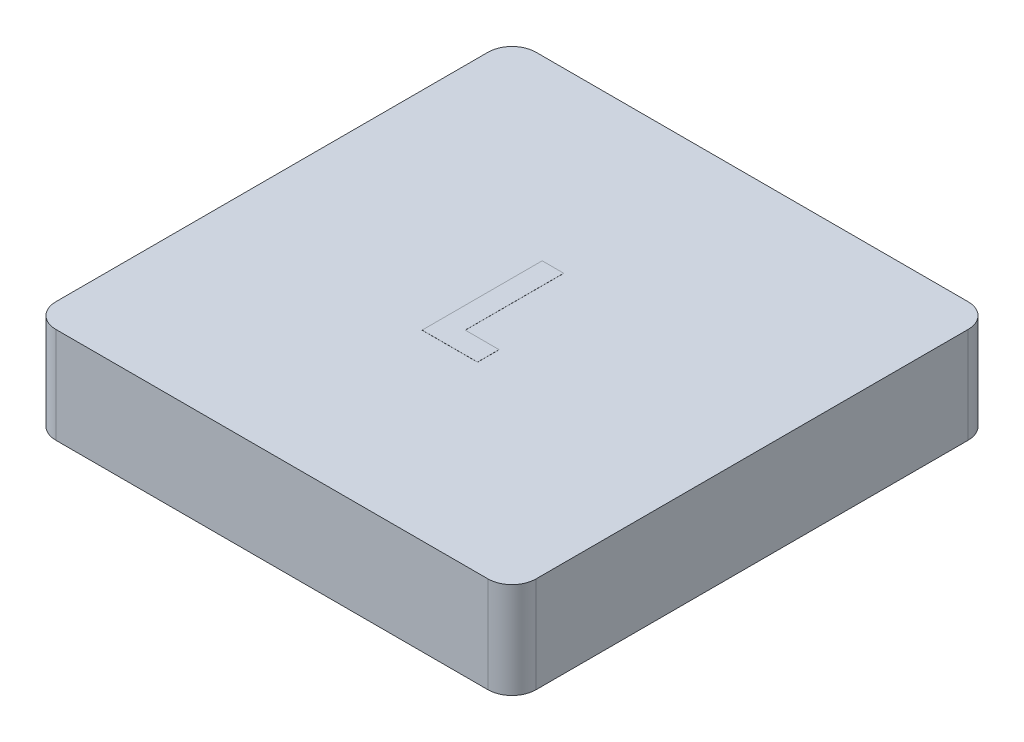
ISO-10303-21;
HEADER;
FILE_DESCRIPTION(('STEP AP214'),'2;1');
FILE_NAME('part.step','',(''),(''),'','','');
FILE_SCHEMA(('AUTOMOTIVE_DESIGN { 1 0 10303 214 1 1 1 1 }'));
ENDSEC;
DATA;
#1=APPLICATION_CONTEXT('core data for automotive mechanical design processes');
#2=APPLICATION_PROTOCOL_DEFINITION('international standard','automotive_design',2000,#1);
#3=PRODUCT_CONTEXT('',#1,'mechanical');
#4=PRODUCT('Part','Part','',(#3));
#5=PRODUCT_RELATED_PRODUCT_CATEGORY('part','',(#4));
#6=PRODUCT_DEFINITION_FORMATION('','',#4);
#7=PRODUCT_DEFINITION_CONTEXT('part definition',#1,'design');
#8=PRODUCT_DEFINITION('design','',#6,#7);
#9=PRODUCT_DEFINITION_SHAPE('','',#8);
#10=(LENGTH_UNIT() NAMED_UNIT(*) SI_UNIT(.MILLI.,.METRE.));
#11=(NAMED_UNIT(*) PLANE_ANGLE_UNIT() SI_UNIT($,.RADIAN.));
#12=(NAMED_UNIT(*) SI_UNIT($,.STERADIAN.) SOLID_ANGLE_UNIT());
#13=UNCERTAINTY_MEASURE_WITH_UNIT(LENGTH_MEASURE(1.E-05),#10,'distance_accuracy_value','');
#14=(GEOMETRIC_REPRESENTATION_CONTEXT(3) GLOBAL_UNCERTAINTY_ASSIGNED_CONTEXT((#13)) GLOBAL_UNIT_ASSIGNED_CONTEXT((#10,
#11,#12)) REPRESENTATION_CONTEXT('',''));
#15=CARTESIAN_POINT('',(0.,0.,0.));
#16=DIRECTION('',(0.,0.,1.));
#17=DIRECTION('',(1.,0.,0.));
#18=AXIS2_PLACEMENT_3D('',#15,#16,#17);
#19=CARTESIAN_POINT('',(0.,2.54,-12.7));
#20=DIRECTION('',(1.,0.,0.));
#21=DIRECTION('',(0.,0.,-1.));
#22=AXIS2_PLACEMENT_3D('',#19,#20,#21);
#23=PLANE('',#22);
#24=DIRECTION('',(0.,0.,1.));
#25=VECTOR('',#24,1.);
#26=CARTESIAN_POINT('',(0.,2.54,-12.7));
#27=LINE('',#26,#25);
#28=CARTESIAN_POINT('',(0.,2.54,-12.065));
#29=VERTEX_POINT('',#28);
#30=CARTESIAN_POINT('',(0.,2.54,-0.635));
#31=VERTEX_POINT('',#30);
#32=EDGE_CURVE('E252',#29,#31,#27,.T.);
#33=ORIENTED_EDGE('',*,*,#32,.F.);
#34=DIRECTION('',(0.,-1.,0.));
#35=VECTOR('',#34,1.);
#36=CARTESIAN_POINT('',(0.,2.54,-12.065));
#37=LINE('',#36,#35);
#38=CARTESIAN_POINT('',(0.,0.,-12.065));
#39=VERTEX_POINT('',#38);
#40=EDGE_CURVE('E277',#29,#39,#37,.T.);
#41=ORIENTED_EDGE('',*,*,#40,.T.);
#42=DIRECTION('',(0.,0.,1.));
#43=VECTOR('',#42,1.);
#44=CARTESIAN_POINT('',(0.,0.,-12.7));
#45=LINE('',#44,#43);
#46=CARTESIAN_POINT('',(0.,0.,-0.635));
#47=VERTEX_POINT('',#46);
#48=EDGE_CURVE('E232',#39,#47,#45,.T.);
#49=ORIENTED_EDGE('',*,*,#48,.T.);
#50=DIRECTION('',(0.,-1.,0.));
#51=VECTOR('',#50,1.);
#52=CARTESIAN_POINT('',(0.,2.54,-0.635));
#53=LINE('',#52,#51);
#54=EDGE_CURVE('E265',#47,#31,#53,.F.);
#55=ORIENTED_EDGE('',*,*,#54,.T.);
#56=EDGE_LOOP('',(#33,#41,#49,#55));
#57=FACE_BOUND('',#56,.T.);
#58=ADVANCED_FACE('F33',(#57),#23,.F.);
#59=CARTESIAN_POINT('',(0.,2.54,0.));
#60=DIRECTION('',(0.,0.,-1.));
#61=DIRECTION('',(-1.,0.,0.));
#62=AXIS2_PLACEMENT_3D('',#59,#60,#61);
#63=PLANE('',#62);
#64=DIRECTION('',(1.,0.,0.));
#65=VECTOR('',#64,1.);
#66=CARTESIAN_POINT('',(0.,0.,0.));
#67=LINE('',#66,#65);
#68=CARTESIAN_POINT('',(0.635,0.,0.));
#69=VERTEX_POINT('',#68);
#70=CARTESIAN_POINT('',(12.065,0.,0.));
#71=VERTEX_POINT('',#70);
#72=EDGE_CURVE('E268',#69,#71,#67,.T.);
#73=ORIENTED_EDGE('',*,*,#72,.T.);
#74=DIRECTION('',(0.,-1.,0.));
#75=VECTOR('',#74,1.);
#76=CARTESIAN_POINT('',(12.065,2.54,0.));
#77=LINE('',#76,#75);
#78=CARTESIAN_POINT('',(12.065,2.54,0.));
#79=VERTEX_POINT('',#78);
#80=EDGE_CURVE('E41',#71,#79,#77,.F.);
#81=ORIENTED_EDGE('',*,*,#80,.T.);
#82=DIRECTION('',(1.,0.,0.));
#83=VECTOR('',#82,1.);
#84=CARTESIAN_POINT('',(0.,2.54,0.));
#85=LINE('',#84,#83);
#86=CARTESIAN_POINT('',(0.635,2.54,0.));
#87=VERTEX_POINT('',#86);
#88=EDGE_CURVE('E255',#87,#79,#85,.T.);
#89=ORIENTED_EDGE('',*,*,#88,.F.);
#90=DIRECTION('',(0.,-1.,0.));
#91=VECTOR('',#90,1.);
#92=CARTESIAN_POINT('',(0.635,2.54,0.));
#93=LINE('',#92,#91);
#94=EDGE_CURVE('E306',#87,#69,#93,.T.);
#95=ORIENTED_EDGE('',*,*,#94,.T.);
#96=EDGE_LOOP('',(#73,#81,#89,#95));
#97=FACE_BOUND('',#96,.T.);
#98=ADVANCED_FACE('F311',(#97),#63,.F.);
#99=CARTESIAN_POINT('',(12.7,2.54,0.));
#100=DIRECTION('',(-1.,0.,0.));
#101=DIRECTION('',(0.,0.,1.));
#102=AXIS2_PLACEMENT_3D('',#99,#100,#101);
#103=PLANE('',#102);
#104=DIRECTION('',(0.,0.,-1.));
#105=VECTOR('',#104,1.);
#106=CARTESIAN_POINT('',(12.7,0.,0.));
#107=LINE('',#106,#105);
#108=CARTESIAN_POINT('',(12.7,0.,-0.635));
#109=VERTEX_POINT('',#108);
#110=CARTESIAN_POINT('',(12.7,0.,-12.065));
#111=VERTEX_POINT('',#110);
#112=EDGE_CURVE('E271',#109,#111,#107,.T.);
#113=ORIENTED_EDGE('',*,*,#112,.T.);
#114=DIRECTION('',(0.,-1.,0.));
#115=VECTOR('',#114,1.);
#116=CARTESIAN_POINT('',(12.7,2.54,-12.065));
#117=LINE('',#116,#115);
#118=CARTESIAN_POINT('',(12.7,2.54,-12.065));
#119=VERTEX_POINT('',#118);
#120=EDGE_CURVE('E304',#111,#119,#117,.F.);
#121=ORIENTED_EDGE('',*,*,#120,.T.);
#122=DIRECTION('',(0.,0.,-1.));
#123=VECTOR('',#122,1.);
#124=CARTESIAN_POINT('',(12.7,2.54,0.));
#125=LINE('',#124,#123);
#126=CARTESIAN_POINT('',(12.7,2.54,-0.635));
#127=VERTEX_POINT('',#126);
#128=EDGE_CURVE('E259',#127,#119,#125,.T.);
#129=ORIENTED_EDGE('',*,*,#128,.F.);
#130=DIRECTION('',(0.,-1.,0.));
#131=VECTOR('',#130,1.);
#132=CARTESIAN_POINT('',(12.7,2.54,-0.635));
#133=LINE('',#132,#131);
#134=EDGE_CURVE('E301',#127,#109,#133,.T.);
#135=ORIENTED_EDGE('',*,*,#134,.T.);
#136=EDGE_LOOP('',(#113,#121,#129,#135));
#137=FACE_BOUND('',#136,.T.);
#138=ADVANCED_FACE('F324',(#137),#103,.F.);
#139=CARTESIAN_POINT('',(12.7,2.54,-12.7));
#140=DIRECTION('',(0.,0.,1.));
#141=DIRECTION('',(1.,0.,0.));
#142=AXIS2_PLACEMENT_3D('',#139,#140,#141);
#143=PLANE('',#142);
#144=DIRECTION('',(-1.,0.,0.));
#145=VECTOR('',#144,1.);
#146=CARTESIAN_POINT('',(12.7,0.,-12.7));
#147=LINE('',#146,#145);
#148=CARTESIAN_POINT('',(12.065,0.,-12.7));
#149=VERTEX_POINT('',#148);
#150=CARTESIAN_POINT('',(0.634999999999995,0.,-12.7));
#151=VERTEX_POINT('',#150);
#152=EDGE_CURVE('E256',#149,#151,#147,.T.);
#153=ORIENTED_EDGE('',*,*,#152,.T.);
#154=DIRECTION('',(0.,-1.,0.));
#155=VECTOR('',#154,1.);
#156=CARTESIAN_POINT('',(0.634999999999995,2.54,-12.7));
#157=LINE('',#156,#155);
#158=CARTESIAN_POINT('',(0.634999999999995,2.54,-12.7));
#159=VERTEX_POINT('',#158);
#160=EDGE_CURVE('E291',#151,#159,#157,.F.);
#161=ORIENTED_EDGE('',*,*,#160,.T.);
#162=DIRECTION('',(-1.,0.,0.));
#163=VECTOR('',#162,1.);
#164=CARTESIAN_POINT('',(12.7,2.54,-12.7));
#165=LINE('',#164,#163);
#166=CARTESIAN_POINT('',(12.065,2.54,-12.7));
#167=VERTEX_POINT('',#166);
#168=EDGE_CURVE('E262',#167,#159,#165,.T.);
#169=ORIENTED_EDGE('',*,*,#168,.F.);
#170=DIRECTION('',(0.,-1.,0.));
#171=VECTOR('',#170,1.);
#172=CARTESIAN_POINT('',(12.065,2.54,-12.7));
#173=LINE('',#172,#171);
#174=EDGE_CURVE('E288',#167,#149,#173,.T.);
#175=ORIENTED_EDGE('',*,*,#174,.T.);
#176=EDGE_LOOP('',(#153,#161,#169,#175));
#177=FACE_BOUND('',#176,.T.);
#178=ADVANCED_FACE('F336',(#177),#143,.F.);
#179=CARTESIAN_POINT('',(0.,2.54,0.));
#180=DIRECTION('',(0.,1.,0.));
#181=DIRECTION('',(0.,0.,1.));
#182=AXIS2_PLACEMENT_3D('',#179,#180,#181);
#183=PLANE('',#182);
#184=DIRECTION('',(0.,0.,-1.));
#185=VECTOR('',#184,1.);
#186=CARTESIAN_POINT('',(5.49714615384615,2.54,-4.826));
#187=LINE('',#186,#185);
#188=CARTESIAN_POINT('',(5.49714615384615,2.54,-4.826));
#189=VERTEX_POINT('',#188);
#190=CARTESIAN_POINT('',(5.49714615384615,2.54,-8.001));
#191=VERTEX_POINT('',#190);
#192=EDGE_CURVE('E194',#189,#191,#187,.T.);
#193=ORIENTED_EDGE('',*,*,#192,.T.);
#194=DIRECTION('',(1.,0.,0.));
#195=VECTOR('',#194,1.);
#196=CARTESIAN_POINT('',(5.49714615384615,2.54,-8.001));
#197=LINE('',#196,#195);
#198=CARTESIAN_POINT('',(6.06701794871794,2.54,-8.001));
#199=VERTEX_POINT('',#198);
#200=EDGE_CURVE('E163',#191,#199,#197,.T.);
#201=ORIENTED_EDGE('',*,*,#200,.T.);
#202=DIRECTION('',(0.,0.,1.));
#203=VECTOR('',#202,1.);
#204=CARTESIAN_POINT('',(6.06701794871794,2.54,-8.001));
#205=LINE('',#204,#203);
#206=CARTESIAN_POINT('',(6.06701794871794,2.54,-5.39587179487179));
#207=VERTEX_POINT('',#206);
#208=EDGE_CURVE('E197',#199,#207,#205,.T.);
#209=ORIENTED_EDGE('',*,*,#208,.T.);
#210=DIRECTION('',(1.,0.,0.));
#211=VECTOR('',#210,1.);
#212=CARTESIAN_POINT('',(6.06701794871794,2.54,-5.39587179487179));
#213=LINE('',#212,#211);
#214=CARTESIAN_POINT('',(6.96253076923076,2.54,-5.39587179487179));
#215=VERTEX_POINT('',#214);
#216=EDGE_CURVE('E199',#207,#215,#213,.T.);
#217=ORIENTED_EDGE('',*,*,#216,.T.);
#218=DIRECTION('',(0.,0.,1.));
#219=VECTOR('',#218,1.);
#220=CARTESIAN_POINT('',(6.96253076923076,2.54,-5.39587179487179));
#221=LINE('',#220,#219);
#222=CARTESIAN_POINT('',(6.96253076923076,2.54,-4.826));
#223=VERTEX_POINT('',#222);
#224=EDGE_CURVE('E53',#215,#223,#221,.T.);
#225=ORIENTED_EDGE('',*,*,#224,.T.);
#226=DIRECTION('',(-1.,0.,0.));
#227=VECTOR('',#226,1.);
#228=CARTESIAN_POINT('',(6.96253076923076,2.54,-4.826));
#229=LINE('',#228,#227);
#230=EDGE_CURVE('E48',#223,#189,#229,.T.);
#231=ORIENTED_EDGE('',*,*,#230,.T.);
#232=EDGE_LOOP('',(#193,#201,#209,#217,#225,#231));
#233=FACE_BOUND('',#232,.T.);
#234=ORIENTED_EDGE('',*,*,#168,.T.);
#235=CARTESIAN_POINT('',(0.634999999999995,2.54,-12.065));
#236=DIRECTION('',(0.,1.,0.));
#237=DIRECTION('',(0.,0.,1.));
#238=AXIS2_PLACEMENT_3D('',#235,#236,#237);
#239=CIRCLE('',#238,0.635);
#240=EDGE_CURVE('E299',#159,#29,#239,.T.);
#241=ORIENTED_EDGE('',*,*,#240,.T.);
#242=ORIENTED_EDGE('',*,*,#32,.T.);
#243=CARTESIAN_POINT('',(0.635,2.54,-0.635));
#244=DIRECTION('',(0.,1.,0.));
#245=DIRECTION('',(0.,0.,1.));
#246=AXIS2_PLACEMENT_3D('',#243,#244,#245);
#247=CIRCLE('',#246,0.635);
#248=EDGE_CURVE('E293',#31,#87,#247,.T.);
#249=ORIENTED_EDGE('',*,*,#248,.T.);
#250=ORIENTED_EDGE('',*,*,#88,.T.);
#251=CARTESIAN_POINT('',(12.065,2.54,-0.635));
#252=DIRECTION('',(0.,1.,0.));
#253=DIRECTION('',(0.,0.,1.));
#254=AXIS2_PLACEMENT_3D('',#251,#252,#253);
#255=CIRCLE('',#254,0.635);
#256=EDGE_CURVE('E295',#79,#127,#255,.T.);
#257=ORIENTED_EDGE('',*,*,#256,.T.);
#258=ORIENTED_EDGE('',*,*,#128,.T.);
#259=CARTESIAN_POINT('',(12.065,2.54,-12.065));
#260=DIRECTION('',(0.,1.,0.));
#261=DIRECTION('',(0.,0.,1.));
#262=AXIS2_PLACEMENT_3D('',#259,#260,#261);
#263=CIRCLE('',#262,0.635);
#264=EDGE_CURVE('E297',#119,#167,#263,.T.);
#265=ORIENTED_EDGE('',*,*,#264,.T.);
#266=EDGE_LOOP('',(#234,#241,#242,#249,#250,#257,#258,#265));
#267=FACE_BOUND('',#266,.T.);
#268=ADVANCED_FACE('F317',(#233,#267),#183,.T.);
#269=CARTESIAN_POINT('',(0.,0.,0.));
#270=DIRECTION('',(0.,1.,0.));
#271=DIRECTION('',(0.,0.,1.));
#272=AXIS2_PLACEMENT_3D('',#269,#270,#271);
#273=PLANE('',#272);
#274=DIRECTION('',(-1.,0.,0.));
#275=VECTOR('',#274,1.);
#276=CARTESIAN_POINT('',(12.7,0.,-12.065));
#277=LINE('',#276,#275);
#278=CARTESIAN_POINT('',(12.065,0.,-12.065));
#279=VERTEX_POINT('',#278);
#280=CARTESIAN_POINT('',(0.634999999999995,0.,-12.065));
#281=VERTEX_POINT('',#280);
#282=EDGE_CURVE('E220',#279,#281,#277,.T.);
#283=ORIENTED_EDGE('',*,*,#282,.T.);
#284=DIRECTION('',(0.,0.,1.));
#285=VECTOR('',#284,1.);
#286=CARTESIAN_POINT('',(0.634999999999995,0.,-12.7));
#287=LINE('',#286,#285);
#288=CARTESIAN_POINT('',(0.635,0.,-0.635));
#289=VERTEX_POINT('',#288);
#290=EDGE_CURVE('E215',#281,#289,#287,.T.);
#291=ORIENTED_EDGE('',*,*,#290,.T.);
#292=DIRECTION('',(1.,0.,0.));
#293=VECTOR('',#292,1.);
#294=CARTESIAN_POINT('',(0.,0.,-0.635));
#295=LINE('',#294,#293);
#296=CARTESIAN_POINT('',(12.065,0.,-0.635));
#297=VERTEX_POINT('',#296);
#298=EDGE_CURVE('E244',#289,#297,#295,.T.);
#299=ORIENTED_EDGE('',*,*,#298,.T.);
#300=DIRECTION('',(0.,0.,-1.));
#301=VECTOR('',#300,1.);
#302=CARTESIAN_POINT('',(12.065,0.,0.));
#303=LINE('',#302,#301);
#304=EDGE_CURVE('E247',#297,#279,#303,.T.);
#305=ORIENTED_EDGE('',*,*,#304,.T.);
#306=EDGE_LOOP('',(#283,#291,#299,#305));
#307=FACE_BOUND('',#306,.T.);
#308=ORIENTED_EDGE('',*,*,#48,.F.);
#309=CARTESIAN_POINT('',(0.634999999999995,0.,-12.065));
#310=DIRECTION('',(0.,1.,0.));
#311=DIRECTION('',(0.,0.,1.));
#312=AXIS2_PLACEMENT_3D('',#309,#310,#311);
#313=CIRCLE('',#312,0.635);
#314=EDGE_CURVE('E286',#39,#151,#313,.F.);
#315=ORIENTED_EDGE('',*,*,#314,.T.);
#316=ORIENTED_EDGE('',*,*,#152,.F.);
#317=CARTESIAN_POINT('',(12.065,0.,-12.065));
#318=DIRECTION('',(0.,1.,0.));
#319=DIRECTION('',(0.,0.,1.));
#320=AXIS2_PLACEMENT_3D('',#317,#318,#319);
#321=CIRCLE('',#320,0.635);
#322=EDGE_CURVE('E284',#149,#111,#321,.F.);
#323=ORIENTED_EDGE('',*,*,#322,.T.);
#324=ORIENTED_EDGE('',*,*,#112,.F.);
#325=CARTESIAN_POINT('',(12.065,0.,-0.635));
#326=DIRECTION('',(0.,1.,0.));
#327=DIRECTION('',(0.,0.,1.));
#328=AXIS2_PLACEMENT_3D('',#325,#326,#327);
#329=CIRCLE('',#328,0.635);
#330=EDGE_CURVE('E282',#109,#71,#329,.F.);
#331=ORIENTED_EDGE('',*,*,#330,.T.);
#332=ORIENTED_EDGE('',*,*,#72,.F.);
#333=CARTESIAN_POINT('',(0.635,0.,-0.635));
#334=DIRECTION('',(0.,1.,0.));
#335=DIRECTION('',(0.,0.,1.));
#336=AXIS2_PLACEMENT_3D('',#333,#334,#335);
#337=CIRCLE('',#336,0.635);
#338=EDGE_CURVE('E280',#69,#47,#337,.F.);
#339=ORIENTED_EDGE('',*,*,#338,.T.);
#340=EDGE_LOOP('',(#308,#315,#316,#323,#324,#331,#332,#339));
#341=FACE_BOUND('',#340,.T.);
#342=ADVANCED_FACE('F328',(#307,#341),#273,.F.);
#343=CARTESIAN_POINT('',(0.634999999999995,2.54,-12.065));
#344=DIRECTION('',(0.,-1.,0.));
#345=DIRECTION('',(0.,0.,-1.));
#346=AXIS2_PLACEMENT_3D('',#343,#344,#345);
#347=CYLINDRICAL_SURFACE('',#346,0.635);
#348=ORIENTED_EDGE('',*,*,#240,.F.);
#349=ORIENTED_EDGE('',*,*,#160,.F.);
#350=ORIENTED_EDGE('',*,*,#314,.F.);
#351=ORIENTED_EDGE('',*,*,#40,.F.);
#352=EDGE_LOOP('',(#348,#349,#350,#351));
#353=FACE_BOUND('',#352,.T.);
#354=ADVANCED_FACE('F342',(#353),#347,.T.);
#355=CARTESIAN_POINT('',(12.065,2.54,-12.065));
#356=DIRECTION('',(0.,-1.,0.));
#357=DIRECTION('',(0.,0.,-1.));
#358=AXIS2_PLACEMENT_3D('',#355,#356,#357);
#359=CYLINDRICAL_SURFACE('',#358,0.635);
#360=ORIENTED_EDGE('',*,*,#264,.F.);
#361=ORIENTED_EDGE('',*,*,#120,.F.);
#362=ORIENTED_EDGE('',*,*,#322,.F.);
#363=ORIENTED_EDGE('',*,*,#174,.F.);
#364=EDGE_LOOP('',(#360,#361,#362,#363));
#365=FACE_BOUND('',#364,.T.);
#366=ADVANCED_FACE('F333',(#365),#359,.T.);
#367=CARTESIAN_POINT('',(12.065,2.54,-0.635));
#368=DIRECTION('',(0.,-1.,0.));
#369=DIRECTION('',(0.,0.,-1.));
#370=AXIS2_PLACEMENT_3D('',#367,#368,#369);
#371=CYLINDRICAL_SURFACE('',#370,0.635);
#372=ORIENTED_EDGE('',*,*,#256,.F.);
#373=ORIENTED_EDGE('',*,*,#80,.F.);
#374=ORIENTED_EDGE('',*,*,#330,.F.);
#375=ORIENTED_EDGE('',*,*,#134,.F.);
#376=EDGE_LOOP('',(#372,#373,#374,#375));
#377=FACE_BOUND('',#376,.T.);
#378=ADVANCED_FACE('F321',(#377),#371,.T.);
#379=CARTESIAN_POINT('',(0.635,2.54,-0.635));
#380=DIRECTION('',(0.,-1.,0.));
#381=DIRECTION('',(0.,0.,-1.));
#382=AXIS2_PLACEMENT_3D('',#379,#380,#381);
#383=CYLINDRICAL_SURFACE('',#382,0.635);
#384=ORIENTED_EDGE('',*,*,#248,.F.);
#385=ORIENTED_EDGE('',*,*,#54,.F.);
#386=ORIENTED_EDGE('',*,*,#338,.F.);
#387=ORIENTED_EDGE('',*,*,#94,.F.);
#388=EDGE_LOOP('',(#384,#385,#386,#387));
#389=FACE_BOUND('',#388,.T.);
#390=ADVANCED_FACE('F35',(#389),#383,.T.);
#391=CARTESIAN_POINT('',(0.634999999999995,2.54,-12.7));
#392=DIRECTION('',(1.,0.,0.));
#393=DIRECTION('',(0.,0.,-1.));
#394=AXIS2_PLACEMENT_3D('',#391,#392,#393);
#395=PLANE('',#394);
#396=DIRECTION('',(0.,0.,1.));
#397=VECTOR('',#396,1.);
#398=CARTESIAN_POINT('',(0.634999999999995,1.905,-12.7));
#399=LINE('',#398,#397);
#400=CARTESIAN_POINT('',(0.634999999999995,1.905,-12.065));
#401=VERTEX_POINT('',#400);
#402=CARTESIAN_POINT('',(0.635,1.905,-0.635));
#403=VERTEX_POINT('',#402);
#404=EDGE_CURVE('E216',#401,#403,#399,.T.);
#405=ORIENTED_EDGE('',*,*,#404,.T.);
#406=DIRECTION('',(0.,1.,0.));
#407=VECTOR('',#406,1.);
#408=CARTESIAN_POINT('',(0.635,2.54,-0.635));
#409=LINE('',#408,#407);
#410=EDGE_CURVE('E225',#289,#403,#409,.T.);
#411=ORIENTED_EDGE('',*,*,#410,.F.);
#412=ORIENTED_EDGE('',*,*,#290,.F.);
#413=DIRECTION('',(0.,1.,0.));
#414=VECTOR('',#413,1.);
#415=CARTESIAN_POINT('',(0.634999999999995,2.54,-12.065));
#416=LINE('',#415,#414);
#417=EDGE_CURVE('E221',#281,#401,#416,.T.);
#418=ORIENTED_EDGE('',*,*,#417,.T.);
#419=EDGE_LOOP('',(#405,#411,#412,#418));
#420=FACE_BOUND('',#419,.T.);
#421=ADVANCED_FACE('F347',(#420),#395,.T.);
#422=CARTESIAN_POINT('',(0.,2.54,-0.635));
#423=DIRECTION('',(0.,0.,-1.));
#424=DIRECTION('',(-1.,0.,0.));
#425=AXIS2_PLACEMENT_3D('',#422,#423,#424);
#426=PLANE('',#425);
#427=ORIENTED_EDGE('',*,*,#298,.F.);
#428=ORIENTED_EDGE('',*,*,#410,.T.);
#429=DIRECTION('',(1.,0.,0.));
#430=VECTOR('',#429,1.);
#431=CARTESIAN_POINT('',(0.,1.905,-0.635));
#432=LINE('',#431,#430);
#433=CARTESIAN_POINT('',(12.065,1.905,-0.635));
#434=VERTEX_POINT('',#433);
#435=EDGE_CURVE('E219',#403,#434,#432,.T.);
#436=ORIENTED_EDGE('',*,*,#435,.T.);
#437=DIRECTION('',(0.,1.,0.));
#438=VECTOR('',#437,1.);
#439=CARTESIAN_POINT('',(12.065,2.54,-0.635));
#440=LINE('',#439,#438);
#441=EDGE_CURVE('E229',#297,#434,#440,.T.);
#442=ORIENTED_EDGE('',*,*,#441,.F.);
#443=EDGE_LOOP('',(#427,#428,#436,#442));
#444=FACE_BOUND('',#443,.T.);
#445=ADVANCED_FACE('F352',(#444),#426,.T.);
#446=CARTESIAN_POINT('',(12.065,2.54,0.));
#447=DIRECTION('',(-1.,0.,0.));
#448=DIRECTION('',(0.,0.,1.));
#449=AXIS2_PLACEMENT_3D('',#446,#447,#448);
#450=PLANE('',#449);
#451=ORIENTED_EDGE('',*,*,#304,.F.);
#452=ORIENTED_EDGE('',*,*,#441,.T.);
#453=DIRECTION('',(0.,0.,-1.));
#454=VECTOR('',#453,1.);
#455=CARTESIAN_POINT('',(12.065,1.905,0.));
#456=LINE('',#455,#454);
#457=CARTESIAN_POINT('',(12.065,1.905,-12.065));
#458=VERTEX_POINT('',#457);
#459=EDGE_CURVE('E235',#434,#458,#456,.T.);
#460=ORIENTED_EDGE('',*,*,#459,.T.);
#461=DIRECTION('',(0.,1.,0.));
#462=VECTOR('',#461,1.);
#463=CARTESIAN_POINT('',(12.065,2.54,-12.065));
#464=LINE('',#463,#462);
#465=EDGE_CURVE('E224',#279,#458,#464,.T.);
#466=ORIENTED_EDGE('',*,*,#465,.F.);
#467=EDGE_LOOP('',(#451,#452,#460,#466));
#468=FACE_BOUND('',#467,.T.);
#469=ADVANCED_FACE('F405',(#468),#450,.T.);
#470=CARTESIAN_POINT('',(12.7,2.54,-12.065));
#471=DIRECTION('',(0.,0.,1.));
#472=DIRECTION('',(1.,0.,0.));
#473=AXIS2_PLACEMENT_3D('',#470,#471,#472);
#474=PLANE('',#473);
#475=ORIENTED_EDGE('',*,*,#282,.F.);
#476=ORIENTED_EDGE('',*,*,#465,.T.);
#477=DIRECTION('',(-1.,0.,0.));
#478=VECTOR('',#477,1.);
#479=CARTESIAN_POINT('',(12.7,1.905,-12.065));
#480=LINE('',#479,#478);
#481=EDGE_CURVE('E228',#458,#401,#480,.T.);
#482=ORIENTED_EDGE('',*,*,#481,.T.);
#483=ORIENTED_EDGE('',*,*,#417,.F.);
#484=EDGE_LOOP('',(#475,#476,#482,#483));
#485=FACE_BOUND('',#484,.T.);
#486=ADVANCED_FACE('F415',(#485),#474,.T.);
#487=CARTESIAN_POINT('',(0.,1.905,0.));
#488=DIRECTION('',(0.,1.,0.));
#489=DIRECTION('',(0.,0.,1.));
#490=AXIS2_PLACEMENT_3D('',#487,#488,#489);
#491=PLANE('',#490);
#492=CARTESIAN_POINT('',(6.34999999999999,1.905,-6.35));
#493=DIRECTION('',(0.,1.,0.));
#494=DIRECTION('',(0.,0.,1.));
#495=AXIS2_PLACEMENT_3D('',#492,#493,#494);
#496=CIRCLE('',#495,2.54);
#497=CARTESIAN_POINT('',(6.34999999999999,1.905,-3.81));
#498=VERTEX_POINT('',#497);
#499=EDGE_CURVE('E11',#498,#498,#496,.F.);
#500=ORIENTED_EDGE('',*,*,#499,.F.);
#501=EDGE_LOOP('',(#500));
#502=FACE_BOUND('',#501,.T.);
#503=ORIENTED_EDGE('',*,*,#481,.F.);
#504=ORIENTED_EDGE('',*,*,#459,.F.);
#505=ORIENTED_EDGE('',*,*,#435,.F.);
#506=ORIENTED_EDGE('',*,*,#404,.F.);
#507=EDGE_LOOP('',(#503,#504,#505,#506));
#508=FACE_BOUND('',#507,.T.);
#509=ADVANCED_FACE('F425',(#502,#508),#491,.F.);
#510=CARTESIAN_POINT('',(6.34999999999999,-7.18420489685532,-6.35));
#511=DIRECTION('',(0.,1.,0.));
#512=DIRECTION('',(0.,0.,1.));
#513=AXIS2_PLACEMENT_3D('',#510,#511,#512);
#514=CYLINDRICAL_SURFACE('',#513,2.54);
#515=CARTESIAN_POINT('',(6.34999999999999,0.,-6.35));
#516=DIRECTION('',(0.,1.,0.));
#517=DIRECTION('',(0.,0.,1.));
#518=AXIS2_PLACEMENT_3D('',#515,#516,#517);
#519=CIRCLE('',#518,2.54);
#520=CARTESIAN_POINT('',(6.34999999999999,0.,-3.81));
#521=VERTEX_POINT('',#520);
#522=EDGE_CURVE('E203',#521,#521,#519,.T.);
#523=CARTESIAN_POINT('',(6.34999999999999,0.,-3.81));
#524=CARTESIAN_POINT('',(6.34999999999999,0.0198437499999991,-3.81));
#525=CARTESIAN_POINT('',(6.34999999999999,0.0396874999999989,-3.81));
#526=CARTESIAN_POINT('',(6.34999999999999,0.079374999999999,-3.81));
#527=CARTESIAN_POINT('',(6.34999999999999,0.0992187499999992,-3.81));
#528=CARTESIAN_POINT('',(6.34999999999999,0.138906249999999,-3.81));
#529=CARTESIAN_POINT('',(6.34999999999999,0.158749999999999,-3.81));
#530=CARTESIAN_POINT('',(6.34999999999999,0.198437499999999,-3.81));
#531=CARTESIAN_POINT('',(6.34999999999999,0.218281249999999,-3.81));
#532=CARTESIAN_POINT('',(6.34999999999999,0.25796875,-3.81));
#533=CARTESIAN_POINT('',(6.34999999999999,0.277812499999999,-3.81));
#534=CARTESIAN_POINT('',(6.34999999999999,0.317499999999999,-3.81));
#535=CARTESIAN_POINT('',(6.34999999999999,0.337343749999999,-3.81));
#536=CARTESIAN_POINT('',(6.34999999999999,0.377031249999999,-3.81));
#537=CARTESIAN_POINT('',(6.34999999999999,0.396874999999999,-3.81));
#538=CARTESIAN_POINT('',(6.34999999999999,0.436562499999999,-3.81));
#539=CARTESIAN_POINT('',(6.34999999999999,0.456406249999999,-3.81));
#540=CARTESIAN_POINT('',(6.34999999999999,0.496093749999999,-3.81));
#541=CARTESIAN_POINT('',(6.34999999999999,0.515937499999999,-3.81));
#542=CARTESIAN_POINT('',(6.34999999999999,0.555624999999999,-3.81));
#543=CARTESIAN_POINT('',(6.34999999999999,0.575468749999999,-3.81));
#544=CARTESIAN_POINT('',(6.34999999999999,0.615156249999999,-3.81));
#545=CARTESIAN_POINT('',(6.34999999999999,0.634999999999999,-3.81));
#546=CARTESIAN_POINT('',(6.34999999999999,0.674687499999998,-3.81));
#547=CARTESIAN_POINT('',(6.34999999999999,0.694531249999998,-3.81));
#548=CARTESIAN_POINT('',(6.34999999999999,0.734218749999998,-3.81));
#549=CARTESIAN_POINT('',(6.34999999999999,0.754062499999998,-3.81));
#550=CARTESIAN_POINT('',(6.34999999999999,0.793749999999998,-3.81));
#551=CARTESIAN_POINT('',(6.34999999999999,0.813593749999999,-3.81));
#552=CARTESIAN_POINT('',(6.34999999999999,0.853281249999999,-3.81));
#553=CARTESIAN_POINT('',(6.34999999999999,0.873124999999999,-3.81));
#554=CARTESIAN_POINT('',(6.34999999999999,0.912812499999999,-3.81));
#555=CARTESIAN_POINT('',(6.34999999999999,0.932656249999999,-3.81));
#556=CARTESIAN_POINT('',(6.34999999999999,0.972343749999998,-3.81));
#557=CARTESIAN_POINT('',(6.34999999999999,0.992187499999998,-3.81));
#558=CARTESIAN_POINT('',(6.34999999999999,1.031875,-3.81));
#559=CARTESIAN_POINT('',(6.34999999999999,1.05171875,-3.81));
#560=CARTESIAN_POINT('',(6.34999999999999,1.09140625,-3.81));
#561=CARTESIAN_POINT('',(6.34999999999999,1.11125,-3.81));
#562=CARTESIAN_POINT('',(6.34999999999999,1.1509375,-3.81));
#563=CARTESIAN_POINT('',(6.34999999999999,1.17078125,-3.81));
#564=CARTESIAN_POINT('',(6.34999999999999,1.21046875,-3.81));
#565=CARTESIAN_POINT('',(6.34999999999999,1.2303125,-3.81));
#566=CARTESIAN_POINT('',(6.34999999999999,1.27,-3.81));
#567=CARTESIAN_POINT('',(6.34999999999999,1.28984375,-3.81));
#568=CARTESIAN_POINT('',(6.34999999999999,1.32953125,-3.81));
#569=CARTESIAN_POINT('',(6.34999999999999,1.349375,-3.81));
#570=CARTESIAN_POINT('',(6.34999999999999,1.3890625,-3.81));
#571=CARTESIAN_POINT('',(6.34999999999999,1.40890625,-3.81));
#572=CARTESIAN_POINT('',(6.34999999999999,1.44859375,-3.81));
#573=CARTESIAN_POINT('',(6.34999999999999,1.4684375,-3.81));
#574=CARTESIAN_POINT('',(6.34999999999999,1.508125,-3.81));
#575=CARTESIAN_POINT('',(6.34999999999999,1.52796875,-3.81));
#576=CARTESIAN_POINT('',(6.34999999999999,1.56765625,-3.81));
#577=CARTESIAN_POINT('',(6.34999999999999,1.5875,-3.81));
#578=CARTESIAN_POINT('',(6.34999999999999,1.6271875,-3.81));
#579=CARTESIAN_POINT('',(6.34999999999999,1.64703125,-3.81));
#580=CARTESIAN_POINT('',(6.34999999999999,1.68671875,-3.81));
#581=CARTESIAN_POINT('',(6.34999999999999,1.7065625,-3.81));
#582=CARTESIAN_POINT('',(6.34999999999999,1.74625,-3.81));
#583=CARTESIAN_POINT('',(6.34999999999999,1.76609375,-3.81));
#584=CARTESIAN_POINT('',(6.34999999999999,1.80578125,-3.81));
#585=CARTESIAN_POINT('',(6.34999999999999,1.825625,-3.81));
#586=CARTESIAN_POINT('',(6.34999999999999,1.8653125,-3.81));
#587=CARTESIAN_POINT('',(6.34999999999999,1.88515625,-3.81));
#588=CARTESIAN_POINT('',(6.34999999999999,1.905,-3.81));
#589=B_SPLINE_CURVE_WITH_KNOTS('',3,(#523,#524,#525,#526,#527,#528,#529,#530,#531,#532,#533,
#534,#535,#536,#537,#538,#539,#540,#541,#542,#543,#544,#545,#546,#547,#548,#549,#550,#551,#552,
#553,#554,#555,#556,#557,#558,#559,#560,#561,#562,#563,#564,#565,#566,#567,#568,#569,#570,#571,
#572,#573,#574,#575,#576,#577,#578,#579,#580,#581,#582,#583,#584,#585,#586,#587,#588),
.UNSPECIFIED.,.F.,.F.,(4,2,2,2,2,2,2,2,2,2,2,2,2,2,2,2,2,2,2,2,2,2,2,2,2,2,2,2,2,2,2,2,4),(0.,
0.0595312499999997,0.1190625,0.17859375,0.238125,0.29765625,0.3571875,0.41671875,0.47625,
0.53578125,0.5953125,0.654843749999999,0.714374999999999,0.773906249999999,0.8334375,0.89296875,
0.952499999999999,1.01203125,1.0715625,1.13109375,1.190625,1.25015625,1.3096875,1.36921875,
1.42875,1.48828125,1.5478125,1.60734375,1.666875,1.72640625,1.7859375,1.84546875,1.905),.UNSPECIFIED.);
#590=EDGE_CURVE('BSEAM435',#521,#498,#589,.T.);
#591=ORIENTED_EDGE('',*,*,#522,.T.);
#592=ORIENTED_EDGE('',*,*,#499,.T.);
#593=ORIENTED_EDGE('',*,*,#590,.T.);
#594=ORIENTED_EDGE('',*,*,#590,.F.);
#595=EDGE_LOOP('',(#591,#593,#592,#594));
#596=FACE_BOUND('',#595,.T.);
#597=ADVANCED_FACE('F435',(#596),#514,.T.);
#598=CARTESIAN_POINT('',(0.,0.,0.));
#599=DIRECTION('',(0.,1.,0.));
#600=DIRECTION('',(0.,0.,1.));
#601=AXIS2_PLACEMENT_3D('',#598,#599,#600);
#602=PLANE('',#601);
#603=ORIENTED_EDGE('',*,*,#522,.F.);
#604=EDGE_LOOP('',(#603));
#605=FACE_BOUND('',#604,.T.);
#606=ADVANCED_FACE('F445',(#605),#602,.F.);
#607=CARTESIAN_POINT('',(5.49714615384615,2.54254,-4.826));
#608=DIRECTION('',(-1.,0.,0.));
#609=DIRECTION('',(0.,0.,1.));
#610=AXIS2_PLACEMENT_3D('',#607,#608,#609);
#611=PLANE('',#610);
#612=ORIENTED_EDGE('',*,*,#192,.F.);
#613=DIRECTION('',(0.,-1.,0.));
#614=VECTOR('',#613,1.);
#615=CARTESIAN_POINT('',(5.49714615384615,2.54254,-4.826));
#616=LINE('',#615,#614);
#617=CARTESIAN_POINT('',(5.49714615384615,2.54254,-4.826));
#618=VERTEX_POINT('',#617);
#619=EDGE_CURVE('E182',#618,#189,#616,.T.);
#620=ORIENTED_EDGE('',*,*,#619,.F.);
#621=DIRECTION('',(0.,0.,-1.));
#622=VECTOR('',#621,1.);
#623=CARTESIAN_POINT('',(5.49714615384615,2.54254,-4.826));
#624=LINE('',#623,#622);
#625=CARTESIAN_POINT('',(5.49714615384615,2.54254,-8.001));
#626=VERTEX_POINT('',#625);
#627=EDGE_CURVE('E175',#618,#626,#624,.T.);
#628=ORIENTED_EDGE('',*,*,#627,.T.);
#629=DIRECTION('',(0.,-1.,0.));
#630=VECTOR('',#629,1.);
#631=CARTESIAN_POINT('',(5.49714615384615,2.54254,-8.001));
#632=LINE('',#631,#630);
#633=EDGE_CURVE('E158',#626,#191,#632,.T.);
#634=ORIENTED_EDGE('',*,*,#633,.T.);
#635=EDGE_LOOP('',(#612,#620,#628,#634));
#636=FACE_BOUND('',#635,.T.);
#637=ADVANCED_FACE('F181',(#636),#611,.T.);
#638=CARTESIAN_POINT('',(6.96253076923076,2.54254,-4.826));
#639=DIRECTION('',(0.,0.,1.));
#640=DIRECTION('',(1.,0.,0.));
#641=AXIS2_PLACEMENT_3D('',#638,#639,#640);
#642=PLANE('',#641);
#643=ORIENTED_EDGE('',*,*,#230,.F.);
#644=DIRECTION('',(0.,-1.,0.));
#645=VECTOR('',#644,1.);
#646=CARTESIAN_POINT('',(6.96253076923076,2.54254,-4.826));
#647=LINE('',#646,#645);
#648=CARTESIAN_POINT('',(6.96253076923076,2.54254,-4.826));
#649=VERTEX_POINT('',#648);
#650=EDGE_CURVE('E204',#649,#223,#647,.T.);
#651=ORIENTED_EDGE('',*,*,#650,.F.);
#652=DIRECTION('',(-1.,0.,0.));
#653=VECTOR('',#652,1.);
#654=CARTESIAN_POINT('',(6.96253076923076,2.54254,-4.826));
#655=LINE('',#654,#653);
#656=EDGE_CURVE('E168',#649,#618,#655,.T.);
#657=ORIENTED_EDGE('',*,*,#656,.T.);
#658=ORIENTED_EDGE('',*,*,#619,.T.);
#659=EDGE_LOOP('',(#643,#651,#657,#658));
#660=FACE_BOUND('',#659,.T.);
#661=ADVANCED_FACE('F472',(#660),#642,.T.);
#662=CARTESIAN_POINT('',(6.96253076923076,2.54254,-5.39587179487179));
#663=DIRECTION('',(1.,0.,0.));
#664=DIRECTION('',(0.,0.,-1.));
#665=AXIS2_PLACEMENT_3D('',#662,#663,#664);
#666=PLANE('',#665);
#667=ORIENTED_EDGE('',*,*,#224,.F.);
#668=DIRECTION('',(0.,-1.,0.));
#669=VECTOR('',#668,1.);
#670=CARTESIAN_POINT('',(6.96253076923076,2.54254,-5.39587179487179));
#671=LINE('',#670,#669);
#672=CARTESIAN_POINT('',(6.96253076923076,2.54254,-5.39587179487179));
#673=VERTEX_POINT('',#672);
#674=EDGE_CURVE('E206',#673,#215,#671,.T.);
#675=ORIENTED_EDGE('',*,*,#674,.F.);
#676=DIRECTION('',(0.,0.,1.));
#677=VECTOR('',#676,1.);
#678=CARTESIAN_POINT('',(6.96253076923076,2.54254,-5.39587179487179));
#679=LINE('',#678,#677);
#680=EDGE_CURVE('E190',#673,#649,#679,.T.);
#681=ORIENTED_EDGE('',*,*,#680,.T.);
#682=ORIENTED_EDGE('',*,*,#650,.T.);
#683=EDGE_LOOP('',(#667,#675,#681,#682));
#684=FACE_BOUND('',#683,.T.);
#685=ADVANCED_FACE('F481',(#684),#666,.T.);
#686=CARTESIAN_POINT('',(6.06701794871794,2.54254,-5.39587179487179));
#687=DIRECTION('',(0.,0.,-1.));
#688=DIRECTION('',(-1.,0.,0.));
#689=AXIS2_PLACEMENT_3D('',#686,#687,#688);
#690=PLANE('',#689);
#691=ORIENTED_EDGE('',*,*,#216,.F.);
#692=DIRECTION('',(0.,-1.,0.));
#693=VECTOR('',#692,1.);
#694=CARTESIAN_POINT('',(6.06701794871794,2.54254,-5.39587179487179));
#695=LINE('',#694,#693);
#696=CARTESIAN_POINT('',(6.06701794871794,2.54254,-5.39587179487179));
#697=VERTEX_POINT('',#696);
#698=EDGE_CURVE('E209',#697,#207,#695,.T.);
#699=ORIENTED_EDGE('',*,*,#698,.F.);
#700=DIRECTION('',(1.,0.,0.));
#701=VECTOR('',#700,1.);
#702=CARTESIAN_POINT('',(6.06701794871794,2.54254,-5.39587179487179));
#703=LINE('',#702,#701);
#704=EDGE_CURVE('E187',#697,#673,#703,.T.);
#705=ORIENTED_EDGE('',*,*,#704,.T.);
#706=ORIENTED_EDGE('',*,*,#674,.T.);
#707=EDGE_LOOP('',(#691,#699,#705,#706));
#708=FACE_BOUND('',#707,.T.);
#709=ADVANCED_FACE('F491',(#708),#690,.T.);
#710=CARTESIAN_POINT('',(6.06701794871794,2.54254,-8.001));
#711=DIRECTION('',(1.,0.,0.));
#712=DIRECTION('',(0.,0.,-1.));
#713=AXIS2_PLACEMENT_3D('',#710,#711,#712);
#714=PLANE('',#713);
#715=ORIENTED_EDGE('',*,*,#208,.F.);
#716=DIRECTION('',(0.,-1.,0.));
#717=VECTOR('',#716,1.);
#718=CARTESIAN_POINT('',(6.06701794871794,2.54254,-8.001));
#719=LINE('',#718,#717);
#720=CARTESIAN_POINT('',(6.06701794871794,2.54254,-8.001));
#721=VERTEX_POINT('',#720);
#722=EDGE_CURVE('E167',#721,#199,#719,.T.);
#723=ORIENTED_EDGE('',*,*,#722,.F.);
#724=DIRECTION('',(0.,0.,1.));
#725=VECTOR('',#724,1.);
#726=CARTESIAN_POINT('',(6.06701794871794,2.54254,-8.001));
#727=LINE('',#726,#725);
#728=EDGE_CURVE('E179',#721,#697,#727,.T.);
#729=ORIENTED_EDGE('',*,*,#728,.T.);
#730=ORIENTED_EDGE('',*,*,#698,.T.);
#731=EDGE_LOOP('',(#715,#723,#729,#730));
#732=FACE_BOUND('',#731,.T.);
#733=ADVANCED_FACE('F501',(#732),#714,.T.);
#734=CARTESIAN_POINT('',(5.49714615384615,2.54254,-8.001));
#735=DIRECTION('',(0.,0.,-1.));
#736=DIRECTION('',(-1.,0.,0.));
#737=AXIS2_PLACEMENT_3D('',#734,#735,#736);
#738=PLANE('',#737);
#739=ORIENTED_EDGE('',*,*,#200,.F.);
#740=ORIENTED_EDGE('',*,*,#633,.F.);
#741=DIRECTION('',(1.,0.,0.));
#742=VECTOR('',#741,1.);
#743=CARTESIAN_POINT('',(5.49714615384615,2.54254,-8.001));
#744=LINE('',#743,#742);
#745=EDGE_CURVE('E162',#626,#721,#744,.T.);
#746=ORIENTED_EDGE('',*,*,#745,.T.);
#747=ORIENTED_EDGE('',*,*,#722,.T.);
#748=EDGE_LOOP('',(#739,#740,#746,#747));
#749=FACE_BOUND('',#748,.T.);
#750=ADVANCED_FACE('F160',(#749),#738,.T.);
#751=CARTESIAN_POINT('',(0.,2.54254,0.));
#752=DIRECTION('',(0.,-1.,0.));
#753=DIRECTION('',(0.,0.,-1.));
#754=AXIS2_PLACEMENT_3D('',#751,#752,#753);
#755=PLANE('',#754);
#756=ORIENTED_EDGE('',*,*,#627,.F.);
#757=ORIENTED_EDGE('',*,*,#656,.F.);
#758=ORIENTED_EDGE('',*,*,#680,.F.);
#759=ORIENTED_EDGE('',*,*,#704,.F.);
#760=ORIENTED_EDGE('',*,*,#728,.F.);
#761=ORIENTED_EDGE('',*,*,#745,.F.);
#762=EDGE_LOOP('',(#756,#757,#758,#759,#760,#761));
#763=FACE_BOUND('',#762,.T.);
#764=ADVANCED_FACE('F173',(#763),#755,.F.);
#765=CLOSED_SHELL('',(#58,#98,#138,#178,#268,#342,#354,#366,#378,#390,#421,#445,#469,#486,#509,
#597,#606,#637,#661,#685,#709,#733,#750,#764));
#766=MANIFOLD_SOLID_BREP('B2',#765);
#767=ADVANCED_BREP_SHAPE_REPRESENTATION('',(#18,#766),#14);
#768=SHAPE_DEFINITION_REPRESENTATION(#9,#767);
ENDSEC;
END-ISO-10303-21;
